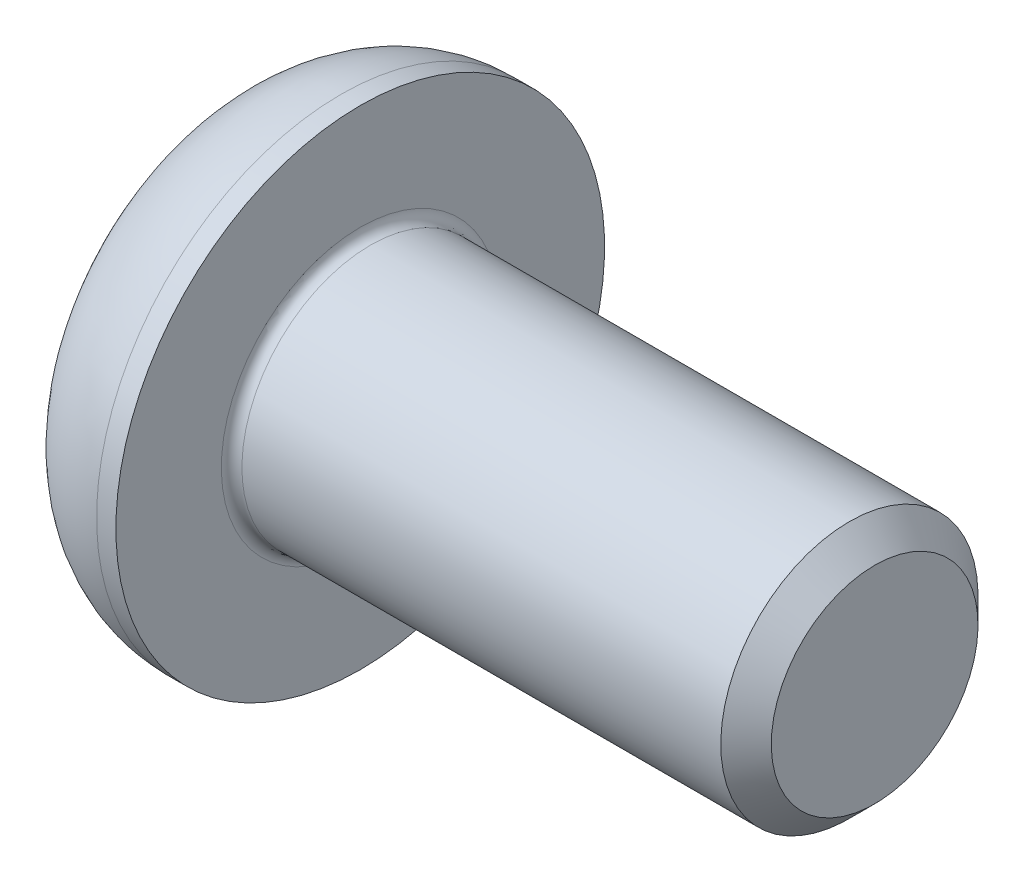
ISO-10303-21;
HEADER;
FILE_DESCRIPTION(('STEP AP214'),'2;1');
FILE_NAME('part.step','',(''),(''),'','','');
FILE_SCHEMA(('AUTOMOTIVE_DESIGN { 1 0 10303 214 1 1 1 1 }'));
ENDSEC;
DATA;
#1=APPLICATION_CONTEXT('core data for automotive mechanical design processes');
#2=APPLICATION_PROTOCOL_DEFINITION('international standard','automotive_design',2000,#1);
#3=PRODUCT_CONTEXT('',#1,'mechanical');
#4=PRODUCT('Part','Part','',(#3));
#5=PRODUCT_RELATED_PRODUCT_CATEGORY('part','',(#4));
#6=PRODUCT_DEFINITION_FORMATION('','',#4);
#7=PRODUCT_DEFINITION_CONTEXT('part definition',#1,'design');
#8=PRODUCT_DEFINITION('design','',#6,#7);
#9=PRODUCT_DEFINITION_SHAPE('','',#8);
#10=(LENGTH_UNIT() NAMED_UNIT(*) SI_UNIT(.MILLI.,.METRE.));
#11=(NAMED_UNIT(*) PLANE_ANGLE_UNIT() SI_UNIT($,.RADIAN.));
#12=(NAMED_UNIT(*) SI_UNIT($,.STERADIAN.) SOLID_ANGLE_UNIT());
#13=UNCERTAINTY_MEASURE_WITH_UNIT(LENGTH_MEASURE(1.E-05),#10,'distance_accuracy_value','');
#14=(GEOMETRIC_REPRESENTATION_CONTEXT(3) GLOBAL_UNCERTAINTY_ASSIGNED_CONTEXT((#13)) GLOBAL_UNIT_ASSIGNED_CONTEXT((#10,
#11,#12)) REPRESENTATION_CONTEXT('',''));
#15=CARTESIAN_POINT('',(0.,0.,0.));
#16=DIRECTION('',(0.,0.,1.));
#17=DIRECTION('',(1.,0.,0.));
#18=AXIS2_PLACEMENT_3D('',#15,#16,#17);
#19=CARTESIAN_POINT('',(0.200000000000003,0.,0.));
#20=DIRECTION('',(-1.,0.,0.));
#21=DIRECTION('',(0.,0.707106781186548,0.707106781186548));
#22=AXIS2_PLACEMENT_3D('',#19,#20,#21);
#23=TOROIDAL_SURFACE('',#22,2.7,0.2);
#24=CARTESIAN_POINT('',(0.,0.,0.));
#25=DIRECTION('',(1.,0.,0.));
#26=DIRECTION('',(0.,-1.,0.));
#27=AXIS2_PLACEMENT_3D('',#24,#25,#26);
#28=CIRCLE('',#27,2.7);
#29=CARTESIAN_POINT('',(0.,2.7,0.));
#30=VERTEX_POINT('',#29);
#31=EDGE_CURVE('E11',#30,#30,#28,.T.);
#32=ORIENTED_EDGE('',*,*,#31,.T.);
#33=EDGE_LOOP('',(#32));
#34=FACE_BOUND('',#33,.T.);
#35=CARTESIAN_POINT('',(0.200000000000003,0.,0.));
#36=DIRECTION('',(-1.,0.,0.));
#37=DIRECTION('',(0.,-1.,0.));
#38=AXIS2_PLACEMENT_3D('',#35,#36,#37);
#39=CIRCLE('',#38,2.5);
#40=CARTESIAN_POINT('',(0.200000000000003,2.5,0.));
#41=VERTEX_POINT('',#40);
#42=EDGE_CURVE('E29',#41,#41,#39,.T.);
#43=ORIENTED_EDGE('',*,*,#42,.T.);
#44=EDGE_LOOP('',(#43));
#45=FACE_BOUND('',#44,.T.);
#46=ADVANCED_FACE('F17',(#34,#45),#23,.F.);
#47=CARTESIAN_POINT('',(5.8,0.,0.));
#48=DIRECTION('',(1.,0.,0.));
#49=DIRECTION('',(0.,1.,0.));
#50=AXIS2_PLACEMENT_3D('',#47,#48,#49);
#51=CYLINDRICAL_SURFACE('',#50,2.5);
#52=CARTESIAN_POINT('',(9.50924,0.,0.));
#53=DIRECTION('',(1.,0.,0.));
#54=DIRECTION('',(0.,-1.,0.));
#55=AXIS2_PLACEMENT_3D('',#52,#53,#54);
#56=CIRCLE('',#55,2.5);
#57=CARTESIAN_POINT('',(9.50924,2.5,0.));
#58=VERTEX_POINT('',#57);
#59=EDGE_CURVE('E241',#58,#58,#56,.T.);
#60=ORIENTED_EDGE('',*,*,#59,.F.);
#61=EDGE_LOOP('',(#60));
#62=FACE_BOUND('',#61,.T.);
#63=ORIENTED_EDGE('',*,*,#42,.F.);
#64=EDGE_LOOP('',(#63));
#65=FACE_BOUND('',#64,.T.);
#66=ADVANCED_FACE('F104',(#62,#65),#51,.T.);
#67=CARTESIAN_POINT('',(0.,3.625,0.));
#68=DIRECTION('',(1.,0.,0.));
#69=DIRECTION('',(0.,0.707106781186548,0.707106781186548));
#70=AXIS2_PLACEMENT_3D('',#67,#68,#69);
#71=PLANE('',#70);
#72=CARTESIAN_POINT('',(0.,0.,0.));
#73=DIRECTION('',(1.,0.,0.));
#74=DIRECTION('',(0.,1.,0.));
#75=AXIS2_PLACEMENT_3D('',#72,#73,#74);
#76=CIRCLE('',#75,4.75);
#77=CARTESIAN_POINT('',(0.,4.75,0.));
#78=VERTEX_POINT('',#77);
#79=EDGE_CURVE('E242',#78,#78,#76,.T.);
#80=ORIENTED_EDGE('',*,*,#79,.T.);
#81=EDGE_LOOP('',(#80));
#82=FACE_BOUND('',#81,.T.);
#83=ORIENTED_EDGE('',*,*,#31,.F.);
#84=EDGE_LOOP('',(#83));
#85=FACE_BOUND('',#84,.T.);
#86=ADVANCED_FACE('F110',(#82,#85),#71,.T.);
#87=CARTESIAN_POINT('',(9.75462,0.,0.));
#88=DIRECTION('',(-1.,0.,0.));
#89=DIRECTION('',(0.,-1.,0.));
#90=AXIS2_PLACEMENT_3D('',#87,#88,#89);
#91=CONICAL_SURFACE('',#90,2.25462,0.785398163397447);
#92=ORIENTED_EDGE('',*,*,#59,.T.);
#93=EDGE_LOOP('',(#92));
#94=FACE_BOUND('',#93,.T.);
#95=CARTESIAN_POINT('',(10.,0.,0.));
#96=DIRECTION('',(-1.,0.,0.));
#97=DIRECTION('',(0.,-1.,0.));
#98=AXIS2_PLACEMENT_3D('',#95,#96,#97);
#99=CIRCLE('',#98,2.00924);
#100=CARTESIAN_POINT('',(10.,2.00924,0.));
#101=VERTEX_POINT('',#100);
#102=EDGE_CURVE('E238',#101,#101,#99,.T.);
#103=ORIENTED_EDGE('',*,*,#102,.T.);
#104=EDGE_LOOP('',(#103));
#105=FACE_BOUND('',#104,.T.);
#106=ADVANCED_FACE('F117',(#94,#105),#91,.T.);
#107=CARTESIAN_POINT('',(10.,1.25,0.));
#108=DIRECTION('',(1.,0.,0.));
#109=DIRECTION('',(0.,0.707106781186548,0.707106781186548));
#110=AXIS2_PLACEMENT_3D('',#107,#108,#109);
#111=PLANE('',#110);
#112=ORIENTED_EDGE('',*,*,#102,.F.);
#113=EDGE_LOOP('',(#112));
#114=FACE_BOUND('',#113,.T.);
#115=ADVANCED_FACE('F121',(#114),#111,.T.);
#116=CARTESIAN_POINT('',(-0.374999999999994,0.,0.));
#117=DIRECTION('',(1.,0.,0.));
#118=DIRECTION('',(0.,0.707106781186548,0.707106781186548));
#119=AXIS2_PLACEMENT_3D('',#116,#117,#118);
#120=DEGENERATE_TOROIDAL_SURFACE('',#119,2.375,2.375,.T.);
#121=CARTESIAN_POINT('',(-2.75,0.,0.));
#122=DIRECTION('',(1.,0.,0.));
#123=DIRECTION('',(0.,-1.,0.));
#124=AXIS2_PLACEMENT_3D('',#121,#122,#123);
#125=CIRCLE('',#124,2.375);
#126=CARTESIAN_POINT('',(-2.75,2.375,0.));
#127=VERTEX_POINT('',#126);
#128=EDGE_CURVE('E235',#127,#127,#125,.T.);
#129=ORIENTED_EDGE('',*,*,#128,.T.);
#130=EDGE_LOOP('',(#129));
#131=FACE_BOUND('',#130,.T.);
#132=CARTESIAN_POINT('',(-0.374999999999994,0.,0.));
#133=DIRECTION('',(-1.,0.,0.));
#134=DIRECTION('',(0.,-1.,0.));
#135=AXIS2_PLACEMENT_3D('',#132,#133,#134);
#136=CIRCLE('',#135,4.75);
#137=CARTESIAN_POINT('',(-0.374999999999994,4.75,0.));
#138=VERTEX_POINT('',#137);
#139=EDGE_CURVE('E232',#138,#138,#136,.T.);
#140=ORIENTED_EDGE('',*,*,#139,.T.);
#141=EDGE_LOOP('',(#140));
#142=FACE_BOUND('',#141,.T.);
#143=ADVANCED_FACE('F125',(#131,#142),#120,.T.);
#144=CARTESIAN_POINT('',(-2.75,3.24102540378444,0.));
#145=DIRECTION('',(-1.,0.,0.));
#146=DIRECTION('',(0.,0.707106781186548,0.707106781186548));
#147=AXIS2_PLACEMENT_3D('',#144,#145,#146);
#148=PLANE('',#147);
#149=DIRECTION('',(0.,0.,1.));
#150=VECTOR('',#149,1.);
#151=CARTESIAN_POINT('',(-2.75,1.5,0.433012701892218));
#152=LINE('',#151,#150);
#153=CARTESIAN_POINT('',(-2.75,1.5,-0.86602540378444));
#154=VERTEX_POINT('',#153);
#155=CARTESIAN_POINT('',(-2.75,1.5,0.866025403784437));
#156=VERTEX_POINT('',#155);
#157=EDGE_CURVE('E229',#154,#156,#152,.T.);
#158=ORIENTED_EDGE('',*,*,#157,.T.);
#159=DIRECTION('',(0.,-0.866025403784438,0.5));
#160=VECTOR('',#159,1.);
#161=CARTESIAN_POINT('',(-2.75,0.375,1.51554445662277));
#162=LINE('',#161,#160);
#163=CARTESIAN_POINT('',(-2.75,0.,1.73205080756888));
#164=VERTEX_POINT('',#163);
#165=EDGE_CURVE('E226',#156,#164,#162,.T.);
#166=ORIENTED_EDGE('',*,*,#165,.T.);
#167=DIRECTION('',(0.,-0.866025403784439,-0.5));
#168=VECTOR('',#167,1.);
#169=CARTESIAN_POINT('',(-2.75,-1.125,1.08253175473055));
#170=LINE('',#169,#168);
#171=CARTESIAN_POINT('',(-2.75,-1.5,0.866025403784439));
#172=VERTEX_POINT('',#171);
#173=EDGE_CURVE('E223',#164,#172,#170,.T.);
#174=ORIENTED_EDGE('',*,*,#173,.T.);
#175=DIRECTION('',(0.,0.,-1.));
#176=VECTOR('',#175,1.);
#177=CARTESIAN_POINT('',(-2.75,-1.5,-0.433012701892219));
#178=LINE('',#177,#176);
#179=CARTESIAN_POINT('',(-2.75,-1.5,-0.866025403784438));
#180=VERTEX_POINT('',#179);
#181=EDGE_CURVE('E220',#172,#180,#178,.T.);
#182=ORIENTED_EDGE('',*,*,#181,.T.);
#183=DIRECTION('',(0.,0.866025403784439,-0.5));
#184=VECTOR('',#183,1.);
#185=CARTESIAN_POINT('',(-2.75,-0.375,-1.51554445662277));
#186=LINE('',#185,#184);
#187=CARTESIAN_POINT('',(-2.75,0.,-1.73205080756888));
#188=VERTEX_POINT('',#187);
#189=EDGE_CURVE('E217',#180,#188,#186,.T.);
#190=ORIENTED_EDGE('',*,*,#189,.T.);
#191=DIRECTION('',(0.,0.866025403784439,0.5));
#192=VECTOR('',#191,1.);
#193=CARTESIAN_POINT('',(-2.75,1.125,-1.08253175473055));
#194=LINE('',#193,#192);
#195=EDGE_CURVE('E209',#188,#154,#194,.T.);
#196=ORIENTED_EDGE('',*,*,#195,.T.);
#197=EDGE_LOOP('',(#158,#166,#174,#182,#190,#196));
#198=FACE_BOUND('',#197,.T.);
#199=ORIENTED_EDGE('',*,*,#128,.F.);
#200=EDGE_LOOP('',(#199));
#201=FACE_BOUND('',#200,.T.);
#202=ADVANCED_FACE('F129',(#198,#201),#148,.T.);
#203=CARTESIAN_POINT('',(-1.375,0.,0.));
#204=DIRECTION('',(1.,0.,0.));
#205=DIRECTION('',(0.,1.,0.));
#206=AXIS2_PLACEMENT_3D('',#203,#204,#205);
#207=CYLINDRICAL_SURFACE('',#206,4.75);
#208=ORIENTED_EDGE('',*,*,#79,.F.);
#209=EDGE_LOOP('',(#208));
#210=FACE_BOUND('',#209,.T.);
#211=ORIENTED_EDGE('',*,*,#139,.F.);
#212=EDGE_LOOP('',(#211));
#213=FACE_BOUND('',#212,.T.);
#214=ADVANCED_FACE('F133',(#210,#213),#207,.T.);
#215=CARTESIAN_POINT('',(-2.75,0.,-1.73205080756888));
#216=DIRECTION('',(0.,-0.5,-0.866025403784439));
#217=DIRECTION('',(0.447213595499958,-0.774596669241483,0.447213595499958));
#218=AXIS2_PLACEMENT_3D('',#215,#216,#217);
#219=PLANE('',#218);
#220=CARTESIAN_POINT('',(-1.19,0.,-1.73205080756888));
#221=CARTESIAN_POINT('',(-0.939999999999993,-0.750000000000002,-1.29903810567665));
#222=CARTESIAN_POINT('',(-1.19,-1.5,-0.866025403784438));
#223=(BOUNDED_CURVE() B_SPLINE_CURVE(2,(#220,#221,#222),.UNSPECIFIED.,.F.,
.F.) B_SPLINE_CURVE_WITH_KNOTS((3,3),(0.,0.175265420711688),
.UNSPECIFIED.) CURVE() GEOMETRIC_REPRESENTATION_ITEM() RATIONAL_B_SPLINE_CURVE((1.,
1.15470053837926,1.)) REPRESENTATION_ITEM(''));
#224=CARTESIAN_POINT('',(-1.19,0.,-1.73205080756888));
#225=VERTEX_POINT('',#224);
#226=CARTESIAN_POINT('',(-1.19,-1.5,-0.866025403784438));
#227=VERTEX_POINT('',#226);
#228=EDGE_CURVE('E164',#225,#227,#223,.T.);
#229=ORIENTED_EDGE('',*,*,#228,.F.);
#230=DIRECTION('',(-1.,0.,0.));
#231=VECTOR('',#230,1.);
#232=CARTESIAN_POINT('',(-1.97,0.,-1.73205080756888));
#233=LINE('',#232,#231);
#234=EDGE_CURVE('E200',#225,#188,#233,.T.);
#235=ORIENTED_EDGE('',*,*,#234,.T.);
#236=ORIENTED_EDGE('',*,*,#189,.F.);
#237=DIRECTION('',(-1.,0.,0.));
#238=VECTOR('',#237,1.);
#239=CARTESIAN_POINT('',(-1.97,-1.5,-0.866025403784438));
#240=LINE('',#239,#238);
#241=EDGE_CURVE('E160',#227,#180,#240,.T.);
#242=ORIENTED_EDGE('',*,*,#241,.F.);
#243=EDGE_LOOP('',(#229,#235,#236,#242));
#244=FACE_BOUND('',#243,.T.);
#245=ADVANCED_FACE('F137',(#244),#219,.F.);
#246=CARTESIAN_POINT('',(-2.75,1.5,-0.86602540378444));
#247=DIRECTION('',(0.,0.5,-0.866025403784439));
#248=DIRECTION('',(0.654653670707977,0.654653670707977,0.377964473009227));
#249=AXIS2_PLACEMENT_3D('',#246,#247,#248);
#250=PLANE('',#249);
#251=CARTESIAN_POINT('',(-1.19,1.5,-0.866025403784439));
#252=CARTESIAN_POINT('',(-0.939999999999992,0.75,-1.29903810567666));
#253=CARTESIAN_POINT('',(-1.19,0.,-1.73205080756888));
#254=(BOUNDED_CURVE() B_SPLINE_CURVE(2,(#251,#252,#253),.UNSPECIFIED.,.F.,
.F.) B_SPLINE_CURVE_WITH_KNOTS((3,3),(0.,0.175265420711688),
.UNSPECIFIED.) CURVE() GEOMETRIC_REPRESENTATION_ITEM() RATIONAL_B_SPLINE_CURVE((1.,
1.15470053837925,1.)) REPRESENTATION_ITEM(''));
#255=CARTESIAN_POINT('',(-1.19,1.5,-0.86602540378444));
#256=VERTEX_POINT('',#255);
#257=EDGE_CURVE('E166',#256,#225,#254,.T.);
#258=ORIENTED_EDGE('',*,*,#257,.F.);
#259=DIRECTION('',(-1.,0.,0.));
#260=VECTOR('',#259,1.);
#261=CARTESIAN_POINT('',(-1.97,1.5,-0.86602540378444));
#262=LINE('',#261,#260);
#263=EDGE_CURVE('E191',#256,#154,#262,.T.);
#264=ORIENTED_EDGE('',*,*,#263,.T.);
#265=ORIENTED_EDGE('',*,*,#195,.F.);
#266=ORIENTED_EDGE('',*,*,#234,.F.);
#267=EDGE_LOOP('',(#258,#264,#265,#266));
#268=FACE_BOUND('',#267,.T.);
#269=ADVANCED_FACE('F141',(#268),#250,.F.);
#270=CARTESIAN_POINT('',(-2.75,1.5,0.866025403784437));
#271=DIRECTION('',(0.,1.,0.));
#272=DIRECTION('',(0.707106781186548,0.,0.707106781186548));
#273=AXIS2_PLACEMENT_3D('',#270,#271,#272);
#274=PLANE('',#273);
#275=CARTESIAN_POINT('',(-1.19,1.5,0.866025403784438));
#276=CARTESIAN_POINT('',(-0.939999999999993,1.5,0.));
#277=CARTESIAN_POINT('',(-1.19,1.5,-0.866025403784441));
#278=(BOUNDED_CURVE() B_SPLINE_CURVE(2,(#275,#276,#277),.UNSPECIFIED.,.F.,
.F.) B_SPLINE_CURVE_WITH_KNOTS((3,3),(0.,0.175265420711688),
.UNSPECIFIED.) CURVE() GEOMETRIC_REPRESENTATION_ITEM() RATIONAL_B_SPLINE_CURVE((1.,
1.15470053837926,1.)) REPRESENTATION_ITEM(''));
#279=CARTESIAN_POINT('',(-1.19,1.5,0.866025403784436));
#280=VERTEX_POINT('',#279);
#281=EDGE_CURVE('E181',#280,#256,#278,.T.);
#282=ORIENTED_EDGE('',*,*,#281,.F.);
#283=DIRECTION('',(-1.,0.,0.));
#284=VECTOR('',#283,1.);
#285=CARTESIAN_POINT('',(-1.97,1.5,0.866025403784436));
#286=LINE('',#285,#284);
#287=EDGE_CURVE('E176',#280,#156,#286,.T.);
#288=ORIENTED_EDGE('',*,*,#287,.T.);
#289=ORIENTED_EDGE('',*,*,#157,.F.);
#290=ORIENTED_EDGE('',*,*,#263,.F.);
#291=EDGE_LOOP('',(#282,#288,#289,#290));
#292=FACE_BOUND('',#291,.T.);
#293=ADVANCED_FACE('F145',(#292),#274,.F.);
#294=CARTESIAN_POINT('',(-2.75,0.,1.73205080756888));
#295=DIRECTION('',(0.,0.5,0.866025403784438));
#296=DIRECTION('',(0.447213595499959,-0.774596669241483,0.447213595499959));
#297=AXIS2_PLACEMENT_3D('',#294,#295,#296);
#298=PLANE('',#297);
#299=CARTESIAN_POINT('',(-1.19,0.,1.73205080756888));
#300=CARTESIAN_POINT('',(-0.939999999999991,0.75,1.29903810567665));
#301=CARTESIAN_POINT('',(-1.19,1.5,0.866025403784435));
#302=(BOUNDED_CURVE() B_SPLINE_CURVE(2,(#299,#300,#301),.UNSPECIFIED.,.F.,
.F.) B_SPLINE_CURVE_WITH_KNOTS((3,3),(0.,0.175265420711689),
.UNSPECIFIED.) CURVE() GEOMETRIC_REPRESENTATION_ITEM() RATIONAL_B_SPLINE_CURVE((1.,
1.15470053837926,1.)) REPRESENTATION_ITEM(''));
#303=CARTESIAN_POINT('',(-1.19,0.,1.73205080756888));
#304=VERTEX_POINT('',#303);
#305=EDGE_CURVE('E179',#304,#280,#302,.T.);
#306=ORIENTED_EDGE('',*,*,#305,.F.);
#307=DIRECTION('',(1.,0.,0.));
#308=VECTOR('',#307,1.);
#309=CARTESIAN_POINT('',(-1.97,0.,1.73205080756888));
#310=LINE('',#309,#308);
#311=EDGE_CURVE('E171',#164,#304,#310,.T.);
#312=ORIENTED_EDGE('',*,*,#311,.F.);
#313=ORIENTED_EDGE('',*,*,#165,.F.);
#314=ORIENTED_EDGE('',*,*,#287,.F.);
#315=EDGE_LOOP('',(#306,#312,#313,#314));
#316=FACE_BOUND('',#315,.T.);
#317=ADVANCED_FACE('F149',(#316),#298,.F.);
#318=CARTESIAN_POINT('',(-2.75,-1.5,-0.866025403784438));
#319=DIRECTION('',(0.,-1.,0.));
#320=DIRECTION('',(0.707106781186548,0.,0.707106781186548));
#321=AXIS2_PLACEMENT_3D('',#318,#319,#320);
#322=PLANE('',#321);
#323=CARTESIAN_POINT('',(-1.19,-1.5,-0.86602540378444));
#324=CARTESIAN_POINT('',(-0.939999999999992,-1.5,0.));
#325=CARTESIAN_POINT('',(-1.19,-1.5,0.866025403784441));
#326=(BOUNDED_CURVE() B_SPLINE_CURVE(2,(#323,#324,#325),.UNSPECIFIED.,.F.,
.F.) B_SPLINE_CURVE_WITH_KNOTS((3,3),(0.,0.175265420711688),
.UNSPECIFIED.) CURVE() GEOMETRIC_REPRESENTATION_ITEM() RATIONAL_B_SPLINE_CURVE((1.,
1.15470053837925,1.)) REPRESENTATION_ITEM(''));
#327=CARTESIAN_POINT('',(-1.19,-1.5,0.866025403784439));
#328=VERTEX_POINT('',#327);
#329=EDGE_CURVE('E90',#227,#328,#326,.T.);
#330=ORIENTED_EDGE('',*,*,#329,.F.);
#331=ORIENTED_EDGE('',*,*,#241,.T.);
#332=ORIENTED_EDGE('',*,*,#181,.F.);
#333=DIRECTION('',(-1.,0.,0.));
#334=VECTOR('',#333,1.);
#335=CARTESIAN_POINT('',(-1.97,-1.5,0.866025403784439));
#336=LINE('',#335,#334);
#337=EDGE_CURVE('E162',#328,#172,#336,.T.);
#338=ORIENTED_EDGE('',*,*,#337,.F.);
#339=EDGE_LOOP('',(#330,#331,#332,#338));
#340=FACE_BOUND('',#339,.T.);
#341=ADVANCED_FACE('F100',(#340),#322,.F.);
#342=CARTESIAN_POINT('',(-2.75,-1.5,0.866025403784439));
#343=DIRECTION('',(0.,-0.5,0.866025403784439));
#344=DIRECTION('',(0.654653670707977,0.654653670707977,0.377964473009227));
#345=AXIS2_PLACEMENT_3D('',#342,#343,#344);
#346=PLANE('',#345);
#347=CARTESIAN_POINT('',(-1.19,-1.5,0.866025403784438));
#348=CARTESIAN_POINT('',(-0.939999999999994,-0.75,1.29903810567666));
#349=CARTESIAN_POINT('',(-1.19,0.,1.73205080756888));
#350=(BOUNDED_CURVE() B_SPLINE_CURVE(2,(#347,#348,#349),.UNSPECIFIED.,.F.,
.F.) B_SPLINE_CURVE_WITH_KNOTS((3,3),(0.,0.175265420711688),
.UNSPECIFIED.) CURVE() GEOMETRIC_REPRESENTATION_ITEM() RATIONAL_B_SPLINE_CURVE((1.,
1.15470053837925,1.)) REPRESENTATION_ITEM(''));
#351=EDGE_CURVE('E21',#328,#304,#350,.T.);
#352=ORIENTED_EDGE('',*,*,#351,.F.);
#353=ORIENTED_EDGE('',*,*,#337,.T.);
#354=ORIENTED_EDGE('',*,*,#173,.F.);
#355=ORIENTED_EDGE('',*,*,#311,.T.);
#356=EDGE_LOOP('',(#352,#353,#354,#355));
#357=FACE_BOUND('',#356,.T.);
#358=ADVANCED_FACE('F95',(#357),#346,.F.);
#359=CARTESIAN_POINT('',(-0.69,0.,0.));
#360=DIRECTION('',(-1.,0.,0.));
#361=DIRECTION('',(0.,1.,0.));
#362=AXIS2_PLACEMENT_3D('',#359,#360,#361);
#363=CONICAL_SURFACE('',#362,0.866025403784439,1.0471975511966);
#364=ORIENTED_EDGE('',*,*,#305,.T.);
#365=ORIENTED_EDGE('',*,*,#281,.T.);
#366=ORIENTED_EDGE('',*,*,#257,.T.);
#367=ORIENTED_EDGE('',*,*,#228,.T.);
#368=ORIENTED_EDGE('',*,*,#329,.T.);
#369=ORIENTED_EDGE('',*,*,#351,.T.);
#370=EDGE_LOOP('',(#364,#365,#366,#367,#368,#369));
#371=FACE_BOUND('',#370,.T.);
#372=CARTESIAN_POINT('',(-0.189999999999993,0.,0.));
#373=VERTEX_POINT('',#372);
#374=VERTEX_LOOP('',#373);
#375=FACE_BOUND('',#374,.T.);
#376=ADVANCED_FACE('F19',(#371,#375),#363,.F.);
#377=CLOSED_SHELL('',(#46,#66,#86,#106,#115,#143,#202,#214,#245,#269,#293,#317,#341,#358,#376));
#378=MANIFOLD_SOLID_BREP('B1',#377);
#379=ADVANCED_BREP_SHAPE_REPRESENTATION('',(#18,#378),#14);
#380=SHAPE_DEFINITION_REPRESENTATION(#9,#379);
ENDSEC;
END-ISO-10303-21;
